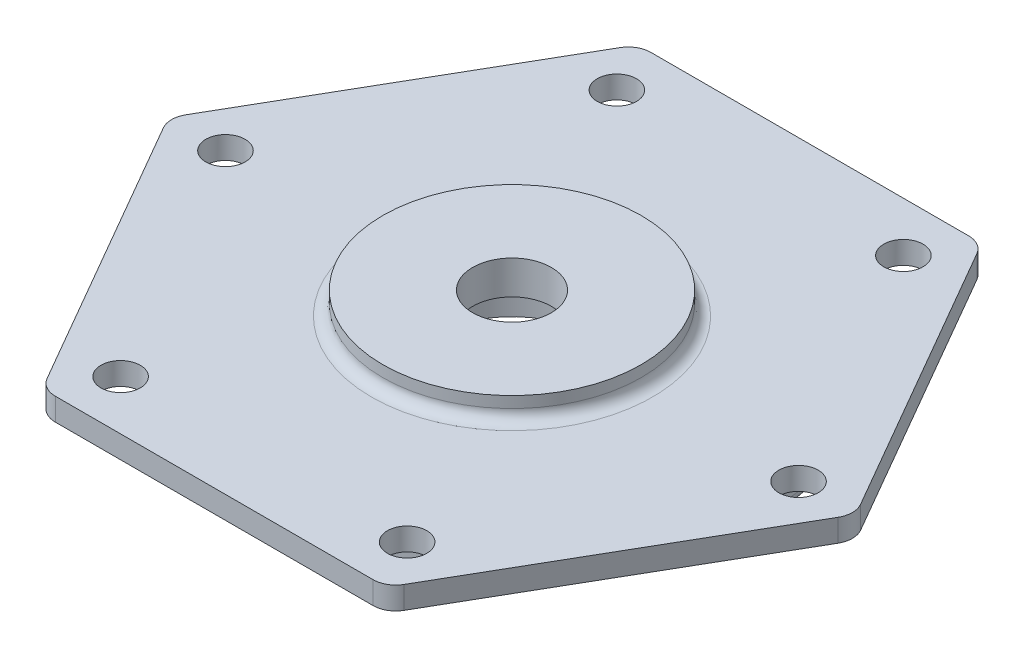
ISO-10303-21;
HEADER;
FILE_DESCRIPTION(('STEP AP214'),'2;1');
FILE_NAME('part.step','',(''),(''),'','','');
FILE_SCHEMA(('AUTOMOTIVE_DESIGN { 1 0 10303 214 1 1 1 1 }'));
ENDSEC;
DATA;
#1=APPLICATION_CONTEXT('core data for automotive mechanical design processes');
#2=APPLICATION_PROTOCOL_DEFINITION('international standard','automotive_design',2000,#1);
#3=PRODUCT_CONTEXT('',#1,'mechanical');
#4=PRODUCT('Part','Part','',(#3));
#5=PRODUCT_RELATED_PRODUCT_CATEGORY('part','',(#4));
#6=PRODUCT_DEFINITION_FORMATION('','',#4);
#7=PRODUCT_DEFINITION_CONTEXT('part definition',#1,'design');
#8=PRODUCT_DEFINITION('design','',#6,#7);
#9=PRODUCT_DEFINITION_SHAPE('','',#8);
#10=(LENGTH_UNIT() NAMED_UNIT(*) SI_UNIT(.MILLI.,.METRE.));
#11=(NAMED_UNIT(*) PLANE_ANGLE_UNIT() SI_UNIT($,.RADIAN.));
#12=(NAMED_UNIT(*) SI_UNIT($,.STERADIAN.) SOLID_ANGLE_UNIT());
#13=UNCERTAINTY_MEASURE_WITH_UNIT(LENGTH_MEASURE(1.E-05),#10,'distance_accuracy_value','');
#14=(GEOMETRIC_REPRESENTATION_CONTEXT(3) GLOBAL_UNCERTAINTY_ASSIGNED_CONTEXT((#13)) GLOBAL_UNIT_ASSIGNED_CONTEXT((#10,
#11,#12)) REPRESENTATION_CONTEXT('',''));
#15=CARTESIAN_POINT('',(0.,0.,0.));
#16=DIRECTION('',(0.,0.,1.));
#17=DIRECTION('',(1.,0.,0.));
#18=AXIS2_PLACEMENT_3D('',#15,#16,#17);
#19=CARTESIAN_POINT('',(-56.5803263805833,4.,0.));
#20=DIRECTION('',(0.,-1.,0.));
#21=DIRECTION('',(0.,0.,-1.));
#22=AXIS2_PLACEMENT_3D('',#19,#20,#21);
#23=CYLINDRICAL_SURFACE('',#22,4.);
#24=CARTESIAN_POINT('',(-56.5803263805833,0.,0.));
#25=DIRECTION('',(0.,1.,0.));
#26=DIRECTION('',(0.,0.,-1.));
#27=AXIS2_PLACEMENT_3D('',#24,#25,#26);
#28=CIRCLE('',#27,4.);
#29=CARTESIAN_POINT('',(-60.0444279957211,0.,-2.00000000000001));
#30=VERTEX_POINT('',#29);
#31=CARTESIAN_POINT('',(-60.0444279957211,0.,2.00000000000002));
#32=VERTEX_POINT('',#31);
#33=EDGE_CURVE('E171',#30,#32,#28,.T.);
#34=ORIENTED_EDGE('',*,*,#33,.T.);
#35=DIRECTION('',(0.,-1.,0.));
#36=VECTOR('',#35,1.);
#37=CARTESIAN_POINT('',(-60.0444279957211,4.,2.00000000000002));
#38=LINE('',#37,#36);
#39=CARTESIAN_POINT('',(-60.0444279957211,4.,2.00000000000002));
#40=VERTEX_POINT('',#39);
#41=EDGE_CURVE('E241',#40,#32,#38,.T.);
#42=ORIENTED_EDGE('',*,*,#41,.F.);
#43=CARTESIAN_POINT('',(-56.5803263805833,4.,0.));
#44=DIRECTION('',(0.,1.,0.));
#45=DIRECTION('',(0.,0.,-1.));
#46=AXIS2_PLACEMENT_3D('',#43,#44,#45);
#47=CIRCLE('',#46,4.);
#48=CARTESIAN_POINT('',(-60.0444279957211,4.,-2.00000000000001));
#49=VERTEX_POINT('',#48);
#50=EDGE_CURVE('E206',#49,#40,#47,.T.);
#51=ORIENTED_EDGE('',*,*,#50,.F.);
#52=DIRECTION('',(0.,-1.,0.));
#53=VECTOR('',#52,1.);
#54=CARTESIAN_POINT('',(-60.0444279957211,4.,-2.00000000000001));
#55=LINE('',#54,#53);
#56=EDGE_CURVE('E167',#49,#30,#55,.T.);
#57=ORIENTED_EDGE('',*,*,#56,.T.);
#58=EDGE_LOOP('',(#34,#42,#51,#57));
#59=FACE_BOUND('',#58,.T.);
#60=ADVANCED_FACE('F42',(#59),#23,.T.);
#61=CARTESIAN_POINT('',(-60.0444279957211,4.,2.00000000000002));
#62=DIRECTION('',(0.866025403784439,0.,-0.5));
#63=DIRECTION('',(-0.5,0.,-0.866025403784439));
#64=AXIS2_PLACEMENT_3D('',#61,#62,#63);
#65=PLANE('',#64);
#66=DIRECTION('',(0.5,0.,0.866025403784439));
#67=VECTOR('',#66,1.);
#68=CARTESIAN_POINT('',(-60.0444279957211,0.,2.00000000000002));
#69=LINE('',#68,#67);
#70=CARTESIAN_POINT('',(-31.7542648054294,0.,51.));
#71=VERTEX_POINT('',#70);
#72=EDGE_CURVE('E175',#32,#71,#69,.T.);
#73=ORIENTED_EDGE('',*,*,#72,.T.);
#74=DIRECTION('',(0.,-1.,0.));
#75=VECTOR('',#74,1.);
#76=CARTESIAN_POINT('',(-31.7542648054294,4.,51.));
#77=LINE('',#76,#75);
#78=CARTESIAN_POINT('',(-31.7542648054294,4.,51.));
#79=VERTEX_POINT('',#78);
#80=EDGE_CURVE('E237',#79,#71,#77,.T.);
#81=ORIENTED_EDGE('',*,*,#80,.F.);
#82=DIRECTION('',(0.5,0.,0.866025403784439));
#83=VECTOR('',#82,1.);
#84=CARTESIAN_POINT('',(-60.0444279957211,4.,2.00000000000002));
#85=LINE('',#84,#83);
#86=EDGE_CURVE('E118',#40,#79,#85,.T.);
#87=ORIENTED_EDGE('',*,*,#86,.F.);
#88=ORIENTED_EDGE('',*,*,#41,.T.);
#89=EDGE_LOOP('',(#73,#81,#87,#88));
#90=FACE_BOUND('',#89,.T.);
#91=ADVANCED_FACE('F378',(#90),#65,.F.);
#92=CARTESIAN_POINT('',(-28.2901631902917,4.,49.));
#93=DIRECTION('',(0.,-1.,0.));
#94=DIRECTION('',(0.,0.,-1.));
#95=AXIS2_PLACEMENT_3D('',#92,#93,#94);
#96=CYLINDRICAL_SURFACE('',#95,4.);
#97=CARTESIAN_POINT('',(-28.2901631902917,0.,49.));
#98=DIRECTION('',(0.,1.,0.));
#99=DIRECTION('',(0.,0.,1.));
#100=AXIS2_PLACEMENT_3D('',#97,#98,#99);
#101=CIRCLE('',#100,4.);
#102=CARTESIAN_POINT('',(-28.2901631902917,0.,53.));
#103=VERTEX_POINT('',#102);
#104=EDGE_CURVE('E179',#71,#103,#101,.T.);
#105=ORIENTED_EDGE('',*,*,#104,.T.);
#106=DIRECTION('',(0.,-1.,0.));
#107=VECTOR('',#106,1.);
#108=CARTESIAN_POINT('',(-28.2901631902917,4.,53.));
#109=LINE('',#108,#107);
#110=CARTESIAN_POINT('',(-28.2901631902917,4.,53.));
#111=VERTEX_POINT('',#110);
#112=EDGE_CURVE('E233',#111,#103,#109,.T.);
#113=ORIENTED_EDGE('',*,*,#112,.F.);
#114=CARTESIAN_POINT('',(-28.2901631902917,4.,49.));
#115=DIRECTION('',(0.,1.,0.));
#116=DIRECTION('',(0.,0.,1.));
#117=AXIS2_PLACEMENT_3D('',#114,#115,#116);
#118=CIRCLE('',#117,4.);
#119=EDGE_CURVE('E331',#79,#111,#118,.T.);
#120=ORIENTED_EDGE('',*,*,#119,.F.);
#121=ORIENTED_EDGE('',*,*,#80,.T.);
#122=EDGE_LOOP('',(#105,#113,#120,#121));
#123=FACE_BOUND('',#122,.T.);
#124=ADVANCED_FACE('F383',(#123),#96,.T.);
#125=CARTESIAN_POINT('',(-28.2901631902916,4.,53.));
#126=DIRECTION('',(0.,0.,-1.));
#127=DIRECTION('',(-1.,0.,0.));
#128=AXIS2_PLACEMENT_3D('',#125,#126,#127);
#129=PLANE('',#128);
#130=DIRECTION('',(1.,0.,0.));
#131=VECTOR('',#130,1.);
#132=CARTESIAN_POINT('',(-28.2901631902916,0.,53.));
#133=LINE('',#132,#131);
#134=CARTESIAN_POINT('',(28.2901631902916,0.,53.));
#135=VERTEX_POINT('',#134);
#136=EDGE_CURVE('E182',#103,#135,#133,.T.);
#137=ORIENTED_EDGE('',*,*,#136,.T.);
#138=DIRECTION('',(0.,-1.,0.));
#139=VECTOR('',#138,1.);
#140=CARTESIAN_POINT('',(28.2901631902916,4.,53.));
#141=LINE('',#140,#139);
#142=CARTESIAN_POINT('',(28.2901631902916,4.,53.));
#143=VERTEX_POINT('',#142);
#144=EDGE_CURVE('E229',#143,#135,#141,.T.);
#145=ORIENTED_EDGE('',*,*,#144,.F.);
#146=DIRECTION('',(1.,0.,0.));
#147=VECTOR('',#146,1.);
#148=CARTESIAN_POINT('',(-28.2901631902916,4.,53.));
#149=LINE('',#148,#147);
#150=EDGE_CURVE('E334',#111,#143,#149,.T.);
#151=ORIENTED_EDGE('',*,*,#150,.F.);
#152=ORIENTED_EDGE('',*,*,#112,.T.);
#153=EDGE_LOOP('',(#137,#145,#151,#152));
#154=FACE_BOUND('',#153,.T.);
#155=ADVANCED_FACE('F745',(#154),#129,.F.);
#156=CARTESIAN_POINT('',(28.2901631902917,4.,49.));
#157=DIRECTION('',(0.,-1.,0.));
#158=DIRECTION('',(0.,0.,-1.));
#159=AXIS2_PLACEMENT_3D('',#156,#157,#158);
#160=CYLINDRICAL_SURFACE('',#159,4.);
#161=CARTESIAN_POINT('',(28.2901631902917,0.,49.));
#162=DIRECTION('',(0.,1.,0.));
#163=DIRECTION('',(0.,0.,1.));
#164=AXIS2_PLACEMENT_3D('',#161,#162,#163);
#165=CIRCLE('',#164,4.);
#166=CARTESIAN_POINT('',(31.7542648054294,0.,51.));
#167=VERTEX_POINT('',#166);
#168=EDGE_CURVE('E185',#135,#167,#165,.T.);
#169=ORIENTED_EDGE('',*,*,#168,.T.);
#170=DIRECTION('',(0.,-1.,0.));
#171=VECTOR('',#170,1.);
#172=CARTESIAN_POINT('',(31.7542648054294,4.,51.));
#173=LINE('',#172,#171);
#174=CARTESIAN_POINT('',(31.7542648054294,4.,51.));
#175=VERTEX_POINT('',#174);
#176=EDGE_CURVE('E225',#175,#167,#173,.T.);
#177=ORIENTED_EDGE('',*,*,#176,.F.);
#178=CARTESIAN_POINT('',(28.2901631902917,4.,49.));
#179=DIRECTION('',(0.,1.,0.));
#180=DIRECTION('',(0.,0.,1.));
#181=AXIS2_PLACEMENT_3D('',#178,#179,#180);
#182=CIRCLE('',#181,4.);
#183=EDGE_CURVE('E337',#143,#175,#182,.T.);
#184=ORIENTED_EDGE('',*,*,#183,.F.);
#185=ORIENTED_EDGE('',*,*,#144,.T.);
#186=EDGE_LOOP('',(#169,#177,#184,#185));
#187=FACE_BOUND('',#186,.T.);
#188=ADVANCED_FACE('F735',(#187),#160,.T.);
#189=CARTESIAN_POINT('',(31.7542648054294,4.,51.));
#190=DIRECTION('',(-0.866025403784439,0.,-0.499999999999999));
#191=DIRECTION('',(-0.499999999999999,0.,0.866025403784439));
#192=AXIS2_PLACEMENT_3D('',#189,#190,#191);
#193=PLANE('',#192);
#194=DIRECTION('',(0.499999999999999,0.,-0.866025403784439));
#195=VECTOR('',#194,1.);
#196=CARTESIAN_POINT('',(31.7542648054294,0.,51.));
#197=LINE('',#196,#195);
#198=CARTESIAN_POINT('',(60.044427995721,0.,2.));
#199=VERTEX_POINT('',#198);
#200=EDGE_CURVE('E188',#167,#199,#197,.T.);
#201=ORIENTED_EDGE('',*,*,#200,.T.);
#202=DIRECTION('',(0.,-1.,0.));
#203=VECTOR('',#202,1.);
#204=CARTESIAN_POINT('',(60.044427995721,4.,2.));
#205=LINE('',#204,#203);
#206=CARTESIAN_POINT('',(60.044427995721,4.,2.));
#207=VERTEX_POINT('',#206);
#208=EDGE_CURVE('E221',#207,#199,#205,.T.);
#209=ORIENTED_EDGE('',*,*,#208,.F.);
#210=DIRECTION('',(0.499999999999999,0.,-0.866025403784439));
#211=VECTOR('',#210,1.);
#212=CARTESIAN_POINT('',(31.7542648054294,4.,51.));
#213=LINE('',#212,#211);
#214=EDGE_CURVE('E340',#175,#207,#213,.T.);
#215=ORIENTED_EDGE('',*,*,#214,.F.);
#216=ORIENTED_EDGE('',*,*,#176,.T.);
#217=EDGE_LOOP('',(#201,#209,#215,#216));
#218=FACE_BOUND('',#217,.T.);
#219=ADVANCED_FACE('F725',(#218),#193,.F.);
#220=CARTESIAN_POINT('',(56.5803263805833,4.,0.));
#221=DIRECTION('',(0.,-1.,0.));
#222=DIRECTION('',(0.,0.,-1.));
#223=AXIS2_PLACEMENT_3D('',#220,#221,#222);
#224=CYLINDRICAL_SURFACE('',#223,4.);
#225=CARTESIAN_POINT('',(56.5803263805833,0.,0.));
#226=DIRECTION('',(0.,1.,0.));
#227=DIRECTION('',(0.,0.,1.));
#228=AXIS2_PLACEMENT_3D('',#225,#226,#227);
#229=CIRCLE('',#228,4.);
#230=CARTESIAN_POINT('',(60.044427995721,0.,-2.00000000000003));
#231=VERTEX_POINT('',#230);
#232=EDGE_CURVE('E191',#199,#231,#229,.T.);
#233=ORIENTED_EDGE('',*,*,#232,.T.);
#234=DIRECTION('',(0.,-1.,0.));
#235=VECTOR('',#234,1.);
#236=CARTESIAN_POINT('',(60.044427995721,4.,-2.00000000000003));
#237=LINE('',#236,#235);
#238=CARTESIAN_POINT('',(60.044427995721,4.,-2.00000000000003));
#239=VERTEX_POINT('',#238);
#240=EDGE_CURVE('E217',#239,#231,#237,.T.);
#241=ORIENTED_EDGE('',*,*,#240,.F.);
#242=CARTESIAN_POINT('',(56.5803263805833,4.,0.));
#243=DIRECTION('',(0.,1.,0.));
#244=DIRECTION('',(0.,0.,1.));
#245=AXIS2_PLACEMENT_3D('',#242,#243,#244);
#246=CIRCLE('',#245,4.);
#247=EDGE_CURVE('E343',#207,#239,#246,.T.);
#248=ORIENTED_EDGE('',*,*,#247,.F.);
#249=ORIENTED_EDGE('',*,*,#208,.T.);
#250=EDGE_LOOP('',(#233,#241,#248,#249));
#251=FACE_BOUND('',#250,.T.);
#252=ADVANCED_FACE('F716',(#251),#224,.T.);
#253=CARTESIAN_POINT('',(60.044427995721,4.,-2.00000000000003));
#254=DIRECTION('',(-0.866025403784439,0.,0.5));
#255=DIRECTION('',(0.5,0.,0.866025403784439));
#256=AXIS2_PLACEMENT_3D('',#253,#254,#255);
#257=PLANE('',#256);
#258=DIRECTION('',(-0.5,0.,-0.866025403784439));
#259=VECTOR('',#258,1.);
#260=CARTESIAN_POINT('',(60.044427995721,0.,-2.00000000000003));
#261=LINE('',#260,#259);
#262=CARTESIAN_POINT('',(31.7542648054294,0.,-51.));
#263=VERTEX_POINT('',#262);
#264=EDGE_CURVE('E194',#231,#263,#261,.T.);
#265=ORIENTED_EDGE('',*,*,#264,.T.);
#266=DIRECTION('',(0.,-1.,0.));
#267=VECTOR('',#266,1.);
#268=CARTESIAN_POINT('',(31.7542648054294,4.,-51.));
#269=LINE('',#268,#267);
#270=CARTESIAN_POINT('',(31.7542648054294,4.,-51.));
#271=VERTEX_POINT('',#270);
#272=EDGE_CURVE('E213',#271,#263,#269,.T.);
#273=ORIENTED_EDGE('',*,*,#272,.F.);
#274=DIRECTION('',(-0.5,0.,-0.866025403784439));
#275=VECTOR('',#274,1.);
#276=CARTESIAN_POINT('',(60.044427995721,4.,-2.00000000000003));
#277=LINE('',#276,#275);
#278=EDGE_CURVE('E346',#239,#271,#277,.T.);
#279=ORIENTED_EDGE('',*,*,#278,.F.);
#280=ORIENTED_EDGE('',*,*,#240,.T.);
#281=EDGE_LOOP('',(#265,#273,#279,#280));
#282=FACE_BOUND('',#281,.T.);
#283=ADVANCED_FACE('F354',(#282),#257,.F.);
#284=CARTESIAN_POINT('',(28.2901631902916,4.,-49.));
#285=DIRECTION('',(0.,-1.,0.));
#286=DIRECTION('',(0.,0.,-1.));
#287=AXIS2_PLACEMENT_3D('',#284,#285,#286);
#288=CYLINDRICAL_SURFACE('',#287,4.);
#289=CARTESIAN_POINT('',(28.2901631902916,0.,-49.));
#290=DIRECTION('',(0.,1.,0.));
#291=DIRECTION('',(0.,0.,-1.));
#292=AXIS2_PLACEMENT_3D('',#289,#290,#291);
#293=CIRCLE('',#292,4.);
#294=CARTESIAN_POINT('',(28.2901631902916,0.,-53.));
#295=VERTEX_POINT('',#294);
#296=EDGE_CURVE('E197',#263,#295,#293,.T.);
#297=ORIENTED_EDGE('',*,*,#296,.T.);
#298=DIRECTION('',(0.,-1.,0.));
#299=VECTOR('',#298,1.);
#300=CARTESIAN_POINT('',(28.2901631902916,4.,-53.));
#301=LINE('',#300,#299);
#302=CARTESIAN_POINT('',(28.2901631902916,4.,-53.));
#303=VERTEX_POINT('',#302);
#304=EDGE_CURVE('E160',#303,#295,#301,.T.);
#305=ORIENTED_EDGE('',*,*,#304,.F.);
#306=CARTESIAN_POINT('',(28.2901631902916,4.,-49.));
#307=DIRECTION('',(0.,1.,0.));
#308=DIRECTION('',(0.,0.,-1.));
#309=AXIS2_PLACEMENT_3D('',#306,#307,#308);
#310=CIRCLE('',#309,4.);
#311=EDGE_CURVE('E149',#271,#303,#310,.T.);
#312=ORIENTED_EDGE('',*,*,#311,.F.);
#313=ORIENTED_EDGE('',*,*,#272,.T.);
#314=EDGE_LOOP('',(#297,#305,#312,#313));
#315=FACE_BOUND('',#314,.T.);
#316=ADVANCED_FACE('F358',(#315),#288,.T.);
#317=CARTESIAN_POINT('',(28.2901631902916,4.,-53.));
#318=DIRECTION('',(0.,0.,1.));
#319=DIRECTION('',(1.,0.,0.));
#320=AXIS2_PLACEMENT_3D('',#317,#318,#319);
#321=PLANE('',#320);
#322=DIRECTION('',(-1.,0.,0.));
#323=VECTOR('',#322,1.);
#324=CARTESIAN_POINT('',(28.2901631902916,0.,-53.));
#325=LINE('',#324,#323);
#326=CARTESIAN_POINT('',(-28.2901631902917,0.,-53.));
#327=VERTEX_POINT('',#326);
#328=EDGE_CURVE('E158',#295,#327,#325,.T.);
#329=ORIENTED_EDGE('',*,*,#328,.T.);
#330=DIRECTION('',(0.,-1.,0.));
#331=VECTOR('',#330,1.);
#332=CARTESIAN_POINT('',(-28.2901631902917,4.,-53.));
#333=LINE('',#332,#331);
#334=CARTESIAN_POINT('',(-28.2901631902917,4.,-53.));
#335=VERTEX_POINT('',#334);
#336=EDGE_CURVE('E155',#335,#327,#333,.T.);
#337=ORIENTED_EDGE('',*,*,#336,.F.);
#338=DIRECTION('',(-1.,0.,0.));
#339=VECTOR('',#338,1.);
#340=CARTESIAN_POINT('',(28.2901631902916,4.,-53.));
#341=LINE('',#340,#339);
#342=EDGE_CURVE('E143',#303,#335,#341,.T.);
#343=ORIENTED_EDGE('',*,*,#342,.F.);
#344=ORIENTED_EDGE('',*,*,#304,.T.);
#345=EDGE_LOOP('',(#329,#337,#343,#344));
#346=FACE_BOUND('',#345,.T.);
#347=ADVANCED_FACE('F156',(#346),#321,.F.);
#348=CARTESIAN_POINT('',(-28.2901631902917,4.,-49.));
#349=DIRECTION('',(0.,-1.,0.));
#350=DIRECTION('',(0.,0.,-1.));
#351=AXIS2_PLACEMENT_3D('',#348,#349,#350);
#352=CYLINDRICAL_SURFACE('',#351,4.);
#353=CARTESIAN_POINT('',(-28.2901631902917,0.,-49.));
#354=DIRECTION('',(0.,1.,0.));
#355=DIRECTION('',(0.,0.,1.));
#356=AXIS2_PLACEMENT_3D('',#353,#354,#355);
#357=CIRCLE('',#356,4.);
#358=CARTESIAN_POINT('',(-31.7542648054294,0.,-51.));
#359=VERTEX_POINT('',#358);
#360=EDGE_CURVE('E103',#327,#359,#357,.T.);
#361=ORIENTED_EDGE('',*,*,#360,.T.);
#362=DIRECTION('',(0.,-1.,0.));
#363=VECTOR('',#362,1.);
#364=CARTESIAN_POINT('',(-31.7542648054294,4.,-51.));
#365=LINE('',#364,#363);
#366=CARTESIAN_POINT('',(-31.7542648054294,4.,-51.));
#367=VERTEX_POINT('',#366);
#368=EDGE_CURVE('E161',#367,#359,#365,.T.);
#369=ORIENTED_EDGE('',*,*,#368,.F.);
#370=CARTESIAN_POINT('',(-28.2901631902917,4.,-49.));
#371=DIRECTION('',(0.,1.,0.));
#372=DIRECTION('',(0.,0.,1.));
#373=AXIS2_PLACEMENT_3D('',#370,#371,#372);
#374=CIRCLE('',#373,4.);
#375=EDGE_CURVE('E147',#335,#367,#374,.T.);
#376=ORIENTED_EDGE('',*,*,#375,.F.);
#377=ORIENTED_EDGE('',*,*,#336,.T.);
#378=EDGE_LOOP('',(#361,#369,#376,#377));
#379=FACE_BOUND('',#378,.T.);
#380=ADVANCED_FACE('F163',(#379),#352,.T.);
#381=CARTESIAN_POINT('',(-31.7542648054294,4.,-51.));
#382=DIRECTION('',(0.866025403784439,0.,0.5));
#383=DIRECTION('',(0.5,0.,-0.866025403784439));
#384=AXIS2_PLACEMENT_3D('',#381,#382,#383);
#385=PLANE('',#384);
#386=DIRECTION('',(-0.5,0.,0.866025403784439));
#387=VECTOR('',#386,1.);
#388=CARTESIAN_POINT('',(-31.7542648054294,0.,-51.));
#389=LINE('',#388,#387);
#390=EDGE_CURVE('E109',#359,#30,#389,.T.);
#391=ORIENTED_EDGE('',*,*,#390,.T.);
#392=ORIENTED_EDGE('',*,*,#56,.F.);
#393=DIRECTION('',(-0.5,0.,0.866025403784439));
#394=VECTOR('',#393,1.);
#395=CARTESIAN_POINT('',(-31.7542648054294,4.,-51.));
#396=LINE('',#395,#394);
#397=EDGE_CURVE('E62',#367,#49,#396,.T.);
#398=ORIENTED_EDGE('',*,*,#397,.F.);
#399=ORIENTED_EDGE('',*,*,#368,.T.);
#400=EDGE_LOOP('',(#391,#392,#398,#399));
#401=FACE_BOUND('',#400,.T.);
#402=ADVANCED_FACE('F366',(#401),#385,.F.);
#403=CARTESIAN_POINT('',(-56.5803263805833,4.,0.));
#404=DIRECTION('',(0.,-1.,0.));
#405=DIRECTION('',(0.,0.,-1.));
#406=AXIS2_PLACEMENT_3D('',#403,#404,#405);
#407=PLANE('',#406);
#408=CARTESIAN_POINT('',(51.,4.,0.));
#409=DIRECTION('',(0.,1.,0.));
#410=DIRECTION('',(0.,0.,1.));
#411=AXIS2_PLACEMENT_3D('',#408,#409,#410);
#412=CIRCLE('',#411,3.5);
#413=CARTESIAN_POINT('',(51.,4.,3.5));
#414=VERTEX_POINT('',#413);
#415=EDGE_CURVE('E269',#414,#414,#412,.T.);
#416=ORIENTED_EDGE('',*,*,#415,.F.);
#417=EDGE_LOOP('',(#416));
#418=FACE_BOUND('',#417,.T.);
#419=CARTESIAN_POINT('',(25.5000000000005,4.,-44.1672955930061));
#420=DIRECTION('',(0.,1.,0.));
#421=DIRECTION('',(0.,0.,1.));
#422=AXIS2_PLACEMENT_3D('',#419,#420,#421);
#423=CIRCLE('',#422,3.5);
#424=CARTESIAN_POINT('',(25.5000000000005,4.,-40.6672955930061));
#425=VERTEX_POINT('',#424);
#426=EDGE_CURVE('E484',#425,#425,#423,.T.);
#427=ORIENTED_EDGE('',*,*,#426,.F.);
#428=EDGE_LOOP('',(#427));
#429=FACE_BOUND('',#428,.T.);
#430=CARTESIAN_POINT('',(-25.4999999999996,4.,-44.1672955930066));
#431=DIRECTION('',(0.,1.,0.));
#432=DIRECTION('',(0.,0.,1.));
#433=AXIS2_PLACEMENT_3D('',#430,#431,#432);
#434=CIRCLE('',#433,3.5);
#435=CARTESIAN_POINT('',(-25.4999999999996,4.,-40.6672955930066));
#436=VERTEX_POINT('',#435);
#437=EDGE_CURVE('E488',#436,#436,#434,.T.);
#438=ORIENTED_EDGE('',*,*,#437,.F.);
#439=EDGE_LOOP('',(#438));
#440=FACE_BOUND('',#439,.T.);
#441=CARTESIAN_POINT('',(-51.,4.,-3.56131096562E-13));
#442=DIRECTION('',(0.,1.,0.));
#443=DIRECTION('',(0.,0.,1.));
#444=AXIS2_PLACEMENT_3D('',#441,#442,#443);
#445=CIRCLE('',#444,3.5);
#446=CARTESIAN_POINT('',(-51.,4.,3.49999999999964));
#447=VERTEX_POINT('',#446);
#448=EDGE_CURVE('E481',#447,#447,#445,.T.);
#449=ORIENTED_EDGE('',*,*,#448,.F.);
#450=EDGE_LOOP('',(#449));
#451=FACE_BOUND('',#450,.T.);
#452=CARTESIAN_POINT('',(-25.5000000000002,4.,44.1672955930063));
#453=DIRECTION('',(0.,1.,0.));
#454=DIRECTION('',(0.,0.,1.));
#455=AXIS2_PLACEMENT_3D('',#452,#453,#454);
#456=CIRCLE('',#455,3.5);
#457=CARTESIAN_POINT('',(-25.5000000000002,4.,47.6672955930063));
#458=VERTEX_POINT('',#457);
#459=EDGE_CURVE('E474',#458,#458,#456,.T.);
#460=ORIENTED_EDGE('',*,*,#459,.F.);
#461=EDGE_LOOP('',(#460));
#462=FACE_BOUND('',#461,.T.);
#463=CARTESIAN_POINT('',(25.4999999999999,4.,44.1672955930064));
#464=DIRECTION('',(0.,1.,0.));
#465=DIRECTION('',(0.,0.,1.));
#466=AXIS2_PLACEMENT_3D('',#463,#464,#465);
#467=CIRCLE('',#466,3.5);
#468=CARTESIAN_POINT('',(25.4999999999999,4.,47.6672955930064));
#469=VERTEX_POINT('',#468);
#470=EDGE_CURVE('E471',#469,#469,#467,.T.);
#471=ORIENTED_EDGE('',*,*,#470,.F.);
#472=EDGE_LOOP('',(#471));
#473=FACE_BOUND('',#472,.T.);
#474=CARTESIAN_POINT('',(0.,4.,0.));
#475=DIRECTION('',(0.,-1.,0.));
#476=DIRECTION('',(0.,0.,-1.));
#477=AXIS2_PLACEMENT_3D('',#474,#475,#476);
#478=CIRCLE('',#477,25.);
#479=CARTESIAN_POINT('',(0.,4.,-25.));
#480=VERTEX_POINT('',#479);
#481=EDGE_CURVE('E249',#480,#480,#478,.T.);
#482=ORIENTED_EDGE('',*,*,#481,.T.);
#483=EDGE_LOOP('',(#482));
#484=FACE_BOUND('',#483,.T.);
#485=ORIENTED_EDGE('',*,*,#50,.T.);
#486=ORIENTED_EDGE('',*,*,#86,.T.);
#487=ORIENTED_EDGE('',*,*,#119,.T.);
#488=ORIENTED_EDGE('',*,*,#150,.T.);
#489=ORIENTED_EDGE('',*,*,#183,.T.);
#490=ORIENTED_EDGE('',*,*,#214,.T.);
#491=ORIENTED_EDGE('',*,*,#247,.T.);
#492=ORIENTED_EDGE('',*,*,#278,.T.);
#493=ORIENTED_EDGE('',*,*,#311,.T.);
#494=ORIENTED_EDGE('',*,*,#342,.T.);
#495=ORIENTED_EDGE('',*,*,#375,.T.);
#496=ORIENTED_EDGE('',*,*,#397,.T.);
#497=EDGE_LOOP('',(#485,#486,#487,#488,#489,#490,#491,#492,#493,#494,#495,#496));
#498=FACE_BOUND('',#497,.T.);
#499=ADVANCED_FACE('F145',(#418,#429,#440,#451,#462,#473,#484,#498),#407,.F.);
#500=CARTESIAN_POINT('',(-56.5803263805833,0.,0.));
#501=DIRECTION('',(0.,-1.,0.));
#502=DIRECTION('',(0.,0.,-1.));
#503=AXIS2_PLACEMENT_3D('',#500,#501,#502);
#504=PLANE('',#503);
#505=CARTESIAN_POINT('',(51.,0.,0.));
#506=DIRECTION('',(0.,-1.,0.));
#507=DIRECTION('',(0.,0.,-1.));
#508=AXIS2_PLACEMENT_3D('',#505,#506,#507);
#509=CIRCLE('',#508,3.5);
#510=CARTESIAN_POINT('',(51.,0.,-3.5));
#511=VERTEX_POINT('',#510);
#512=EDGE_CURVE('E46',#511,#511,#509,.T.);
#513=ORIENTED_EDGE('',*,*,#512,.F.);
#514=EDGE_LOOP('',(#513));
#515=FACE_BOUND('',#514,.T.);
#516=CARTESIAN_POINT('',(25.5000000000005,0.,-44.1672955930061));
#517=DIRECTION('',(0.,-1.,0.));
#518=DIRECTION('',(0.,0.,-1.));
#519=AXIS2_PLACEMENT_3D('',#516,#517,#518);
#520=CIRCLE('',#519,3.5);
#521=CARTESIAN_POINT('',(25.5000000000005,0.,-47.6672955930061));
#522=VERTEX_POINT('',#521);
#523=EDGE_CURVE('E280',#522,#522,#520,.T.);
#524=ORIENTED_EDGE('',*,*,#523,.F.);
#525=EDGE_LOOP('',(#524));
#526=FACE_BOUND('',#525,.T.);
#527=CARTESIAN_POINT('',(-25.4999999999996,0.,-44.1672955930066));
#528=DIRECTION('',(0.,-1.,0.));
#529=DIRECTION('',(0.,0.,-1.));
#530=AXIS2_PLACEMENT_3D('',#527,#528,#529);
#531=CIRCLE('',#530,3.5);
#532=CARTESIAN_POINT('',(-25.4999999999996,0.,-47.6672955930066));
#533=VERTEX_POINT('',#532);
#534=EDGE_CURVE('E277',#533,#533,#531,.T.);
#535=ORIENTED_EDGE('',*,*,#534,.F.);
#536=EDGE_LOOP('',(#535));
#537=FACE_BOUND('',#536,.T.);
#538=CARTESIAN_POINT('',(-51.,0.,-3.56131096562E-13));
#539=DIRECTION('',(0.,-1.,0.));
#540=DIRECTION('',(0.,0.,-1.));
#541=AXIS2_PLACEMENT_3D('',#538,#539,#540);
#542=CIRCLE('',#541,3.5);
#543=CARTESIAN_POINT('',(-51.,0.,-3.50000000000036));
#544=VERTEX_POINT('',#543);
#545=EDGE_CURVE('E273',#544,#544,#542,.T.);
#546=ORIENTED_EDGE('',*,*,#545,.F.);
#547=EDGE_LOOP('',(#546));
#548=FACE_BOUND('',#547,.T.);
#549=CARTESIAN_POINT('',(-25.5000000000002,0.,44.1672955930063));
#550=DIRECTION('',(0.,-1.,0.));
#551=DIRECTION('',(0.,0.,-1.));
#552=AXIS2_PLACEMENT_3D('',#549,#550,#551);
#553=CIRCLE('',#552,3.5);
#554=CARTESIAN_POINT('',(-25.5000000000002,0.,40.6672955930063));
#555=VERTEX_POINT('',#554);
#556=EDGE_CURVE('E268',#555,#555,#553,.T.);
#557=ORIENTED_EDGE('',*,*,#556,.F.);
#558=EDGE_LOOP('',(#557));
#559=FACE_BOUND('',#558,.T.);
#560=CARTESIAN_POINT('',(25.4999999999999,0.,44.1672955930064));
#561=DIRECTION('',(0.,-1.,0.));
#562=DIRECTION('',(0.,0.,-1.));
#563=AXIS2_PLACEMENT_3D('',#560,#561,#562);
#564=CIRCLE('',#563,3.5);
#565=CARTESIAN_POINT('',(25.4999999999999,0.,40.6672955930064));
#566=VERTEX_POINT('',#565);
#567=EDGE_CURVE('E264',#566,#566,#564,.T.);
#568=ORIENTED_EDGE('',*,*,#567,.F.);
#569=EDGE_LOOP('',(#568));
#570=FACE_BOUND('',#569,.T.);
#571=CARTESIAN_POINT('',(0.,0.,0.));
#572=DIRECTION('',(0.,-1.,0.));
#573=DIRECTION('',(0.,0.,-1.));
#574=AXIS2_PLACEMENT_3D('',#571,#572,#573);
#575=CIRCLE('',#574,45.);
#576=CARTESIAN_POINT('',(0.,0.,-45.));
#577=VERTEX_POINT('',#576);
#578=EDGE_CURVE('E244',#577,#577,#575,.T.);
#579=ORIENTED_EDGE('',*,*,#578,.F.);
#580=EDGE_LOOP('',(#579));
#581=FACE_BOUND('',#580,.T.);
#582=ORIENTED_EDGE('',*,*,#33,.F.);
#583=ORIENTED_EDGE('',*,*,#390,.F.);
#584=ORIENTED_EDGE('',*,*,#360,.F.);
#585=ORIENTED_EDGE('',*,*,#328,.F.);
#586=ORIENTED_EDGE('',*,*,#296,.F.);
#587=ORIENTED_EDGE('',*,*,#264,.F.);
#588=ORIENTED_EDGE('',*,*,#232,.F.);
#589=ORIENTED_EDGE('',*,*,#200,.F.);
#590=ORIENTED_EDGE('',*,*,#168,.F.);
#591=ORIENTED_EDGE('',*,*,#136,.F.);
#592=ORIENTED_EDGE('',*,*,#104,.F.);
#593=ORIENTED_EDGE('',*,*,#72,.F.);
#594=EDGE_LOOP('',(#582,#583,#584,#585,#586,#587,#588,#589,#590,#591,#592,#593));
#595=FACE_BOUND('',#594,.T.);
#596=ADVANCED_FACE('F361',(#515,#526,#537,#548,#559,#570,#581,#595),#504,.T.);
#597=CARTESIAN_POINT('',(0.,8.,0.));
#598=DIRECTION('',(0.,-1.,0.));
#599=DIRECTION('',(0.,0.,-1.));
#600=AXIS2_PLACEMENT_3D('',#597,#598,#599);
#601=CYLINDRICAL_SURFACE('',#600,23.);
#602=CARTESIAN_POINT('',(0.,6.,0.));
#603=DIRECTION('',(0.,-1.,0.));
#604=DIRECTION('',(0.,0.,-1.));
#605=AXIS2_PLACEMENT_3D('',#602,#603,#604);
#606=CIRCLE('',#605,23.);
#607=CARTESIAN_POINT('',(0.,6.,-23.));
#608=VERTEX_POINT('',#607);
#609=EDGE_CURVE('E245',#608,#608,#606,.F.);
#610=ORIENTED_EDGE('',*,*,#609,.T.);
#611=EDGE_LOOP('',(#610));
#612=FACE_BOUND('',#611,.T.);
#613=CARTESIAN_POINT('',(0.,8.,0.));
#614=DIRECTION('',(0.,1.,0.));
#615=DIRECTION('',(0.,0.,1.));
#616=AXIS2_PLACEMENT_3D('',#613,#614,#615);
#617=CIRCLE('',#616,23.);
#618=CARTESIAN_POINT('',(0.,8.,23.));
#619=VERTEX_POINT('',#618);
#620=EDGE_CURVE('E176',#619,#619,#617,.T.);
#621=ORIENTED_EDGE('',*,*,#620,.F.);
#622=EDGE_LOOP('',(#621));
#623=FACE_BOUND('',#622,.T.);
#624=ADVANCED_FACE('F444',(#612,#623),#601,.T.);
#625=CARTESIAN_POINT('',(0.,8.,0.));
#626=DIRECTION('',(0.,1.,0.));
#627=DIRECTION('',(0.,0.,1.));
#628=AXIS2_PLACEMENT_3D('',#625,#626,#627);
#629=PLANE('',#628);
#630=CARTESIAN_POINT('',(0.,8.,0.));
#631=DIRECTION('',(0.,-1.,0.));
#632=DIRECTION('',(0.,0.,-1.));
#633=AXIS2_PLACEMENT_3D('',#630,#631,#632);
#634=CIRCLE('',#633,7.);
#635=CARTESIAN_POINT('',(0.,8.,-7.));
#636=VERTEX_POINT('',#635);
#637=EDGE_CURVE('E292',#636,#636,#634,.T.);
#638=ORIENTED_EDGE('',*,*,#637,.T.);
#639=EDGE_LOOP('',(#638));
#640=FACE_BOUND('',#639,.T.);
#641=ORIENTED_EDGE('',*,*,#620,.T.);
#642=EDGE_LOOP('',(#641));
#643=FACE_BOUND('',#642,.T.);
#644=ADVANCED_FACE('F440',(#640,#643),#629,.T.);
#645=CARTESIAN_POINT('',(0.,-6.,0.));
#646=DIRECTION('',(0.,1.,0.));
#647=DIRECTION('',(0.,0.,1.));
#648=AXIS2_PLACEMENT_3D('',#645,#646,#647);
#649=CYLINDRICAL_SURFACE('',#648,45.);
#650=CARTESIAN_POINT('',(0.,-4.,0.));
#651=DIRECTION('',(0.,-1.,0.));
#652=DIRECTION('',(0.,0.,-1.));
#653=AXIS2_PLACEMENT_3D('',#650,#651,#652);
#654=CIRCLE('',#653,45.);
#655=CARTESIAN_POINT('',(0.,-4.,-45.));
#656=VERTEX_POINT('',#655);
#657=EDGE_CURVE('E11',#656,#656,#654,.F.);
#658=ORIENTED_EDGE('',*,*,#657,.T.);
#659=EDGE_LOOP('',(#658));
#660=FACE_BOUND('',#659,.T.);
#661=ORIENTED_EDGE('',*,*,#578,.T.);
#662=EDGE_LOOP('',(#661));
#663=FACE_BOUND('',#662,.T.);
#664=ADVANCED_FACE('F436',(#660,#663),#649,.T.);
#665=CARTESIAN_POINT('',(0.,-6.,0.));
#666=DIRECTION('',(0.,-1.,0.));
#667=DIRECTION('',(0.,0.,-1.));
#668=AXIS2_PLACEMENT_3D('',#665,#666,#667);
#669=PLANE('',#668);
#670=CARTESIAN_POINT('',(0.,-6.,0.));
#671=DIRECTION('',(0.,-1.,0.));
#672=DIRECTION('',(0.,0.,-1.));
#673=AXIS2_PLACEMENT_3D('',#670,#671,#672);
#674=CIRCLE('',#673,43.);
#675=CARTESIAN_POINT('',(0.,-6.,-43.));
#676=VERTEX_POINT('',#675);
#677=EDGE_CURVE('E53',#676,#676,#674,.T.);
#678=ORIENTED_EDGE('',*,*,#677,.T.);
#679=EDGE_LOOP('',(#678));
#680=FACE_BOUND('',#679,.T.);
#681=CARTESIAN_POINT('',(0.,-6.,0.));
#682=DIRECTION('',(0.,-1.,0.));
#683=DIRECTION('',(0.,0.,-1.));
#684=AXIS2_PLACEMENT_3D('',#681,#682,#683);
#685=CIRCLE('',#684,40.);
#686=CARTESIAN_POINT('',(0.,-6.,-40.));
#687=VERTEX_POINT('',#686);
#688=EDGE_CURVE('E313',#687,#687,#685,.T.);
#689=ORIENTED_EDGE('',*,*,#688,.F.);
#690=EDGE_LOOP('',(#689));
#691=FACE_BOUND('',#690,.T.);
#692=ADVANCED_FACE('F409',(#680,#691),#669,.T.);
#693=CARTESIAN_POINT('',(0.,0.,0.));
#694=DIRECTION('',(0.,-1.,0.));
#695=DIRECTION('',(0.,0.,-1.));
#696=AXIS2_PLACEMENT_3D('',#693,#694,#695);
#697=CYLINDRICAL_SURFACE('',#696,40.);
#698=CARTESIAN_POINT('',(0.,0.,0.));
#699=DIRECTION('',(0.,-1.,0.));
#700=DIRECTION('',(0.,0.,-1.));
#701=AXIS2_PLACEMENT_3D('',#698,#699,#700);
#702=CIRCLE('',#701,40.);
#703=CARTESIAN_POINT('',(0.,0.,-40.));
#704=VERTEX_POINT('',#703);
#705=EDGE_CURVE('E314',#704,#704,#702,.T.);
#706=ORIENTED_EDGE('',*,*,#705,.F.);
#707=EDGE_LOOP('',(#706));
#708=FACE_BOUND('',#707,.T.);
#709=ORIENTED_EDGE('',*,*,#688,.T.);
#710=EDGE_LOOP('',(#709));
#711=FACE_BOUND('',#710,.T.);
#712=ADVANCED_FACE('F430',(#708,#711),#697,.F.);
#713=CARTESIAN_POINT('',(0.,0.,0.));
#714=DIRECTION('',(0.,-1.,0.));
#715=DIRECTION('',(0.,0.,-1.));
#716=AXIS2_PLACEMENT_3D('',#713,#714,#715);
#717=PLANE('',#716);
#718=CARTESIAN_POINT('',(0.,0.,0.));
#719=DIRECTION('',(0.,-1.,0.));
#720=DIRECTION('',(0.,0.,-1.));
#721=AXIS2_PLACEMENT_3D('',#718,#719,#720);
#722=CIRCLE('',#721,19.);
#723=CARTESIAN_POINT('',(0.,0.,-19.));
#724=VERTEX_POINT('',#723);
#725=EDGE_CURVE('E306',#724,#724,#722,.T.);
#726=ORIENTED_EDGE('',*,*,#725,.F.);
#727=EDGE_LOOP('',(#726));
#728=FACE_BOUND('',#727,.T.);
#729=ORIENTED_EDGE('',*,*,#705,.T.);
#730=EDGE_LOOP('',(#729));
#731=FACE_BOUND('',#730,.T.);
#732=ADVANCED_FACE('F426',(#728,#731),#717,.T.);
#733=CARTESIAN_POINT('',(0.,0.,0.));
#734=DIRECTION('',(0.,-1.,0.));
#735=DIRECTION('',(0.,0.,-1.));
#736=AXIS2_PLACEMENT_3D('',#733,#734,#735);
#737=CYLINDRICAL_SURFACE('',#736,19.);
#738=CARTESIAN_POINT('',(0.,-4.,0.));
#739=DIRECTION('',(0.,-1.,0.));
#740=DIRECTION('',(0.,0.,-1.));
#741=AXIS2_PLACEMENT_3D('',#738,#739,#740);
#742=CIRCLE('',#741,19.);
#743=CARTESIAN_POINT('',(0.,-4.,-19.));
#744=VERTEX_POINT('',#743);
#745=EDGE_CURVE('E257',#744,#744,#742,.F.);
#746=ORIENTED_EDGE('',*,*,#745,.T.);
#747=EDGE_LOOP('',(#746));
#748=FACE_BOUND('',#747,.T.);
#749=ORIENTED_EDGE('',*,*,#725,.T.);
#750=EDGE_LOOP('',(#749));
#751=FACE_BOUND('',#750,.T.);
#752=ADVANCED_FACE('F407',(#748,#751),#737,.T.);
#753=CARTESIAN_POINT('',(0.,-6.,0.));
#754=DIRECTION('',(0.,-1.,0.));
#755=DIRECTION('',(0.,0.,-1.));
#756=AXIS2_PLACEMENT_3D('',#753,#754,#755);
#757=CIRCLE('',#756,17.);
#758=CARTESIAN_POINT('',(0.,-6.,-17.));
#759=VERTEX_POINT('',#758);
#760=EDGE_CURVE('E253',#759,#759,#757,.T.);
#761=ORIENTED_EDGE('',*,*,#760,.T.);
#762=EDGE_LOOP('',(#761));
#763=FACE_BOUND('',#762,.T.);
#764=CARTESIAN_POINT('',(0.,-6.,0.));
#765=DIRECTION('',(0.,-1.,0.));
#766=DIRECTION('',(0.,0.,-1.));
#767=AXIS2_PLACEMENT_3D('',#764,#765,#766);
#768=CIRCLE('',#767,14.);
#769=CARTESIAN_POINT('',(0.,-6.,-14.));
#770=VERTEX_POINT('',#769);
#771=EDGE_CURVE('E298',#770,#770,#768,.T.);
#772=ORIENTED_EDGE('',*,*,#771,.F.);
#773=EDGE_LOOP('',(#772));
#774=FACE_BOUND('',#773,.T.);
#775=ADVANCED_FACE('F403',(#763,#774),#669,.T.);
#776=CARTESIAN_POINT('',(0.,2.,0.));
#777=DIRECTION('',(0.,-1.,0.));
#778=DIRECTION('',(0.,0.,-1.));
#779=AXIS2_PLACEMENT_3D('',#776,#777,#778);
#780=CYLINDRICAL_SURFACE('',#779,14.);
#781=CARTESIAN_POINT('',(0.,2.,0.));
#782=DIRECTION('',(0.,-1.,0.));
#783=DIRECTION('',(0.,0.,-1.));
#784=AXIS2_PLACEMENT_3D('',#781,#782,#783);
#785=CIRCLE('',#784,14.);
#786=CARTESIAN_POINT('',(0.,2.,-14.));
#787=VERTEX_POINT('',#786);
#788=EDGE_CURVE('E302',#787,#787,#785,.T.);
#789=ORIENTED_EDGE('',*,*,#788,.F.);
#790=EDGE_LOOP('',(#789));
#791=FACE_BOUND('',#790,.T.);
#792=ORIENTED_EDGE('',*,*,#771,.T.);
#793=EDGE_LOOP('',(#792));
#794=FACE_BOUND('',#793,.T.);
#795=ADVANCED_FACE('F406',(#791,#794),#780,.F.);
#796=CARTESIAN_POINT('',(0.,2.,0.));
#797=DIRECTION('',(0.,-1.,0.));
#798=DIRECTION('',(0.,0.,-1.));
#799=AXIS2_PLACEMENT_3D('',#796,#797,#798);
#800=PLANE('',#799);
#801=CARTESIAN_POINT('',(0.,2.,0.));
#802=DIRECTION('',(0.,-1.,0.));
#803=DIRECTION('',(0.,0.,-1.));
#804=AXIS2_PLACEMENT_3D('',#801,#802,#803);
#805=CIRCLE('',#804,7.);
#806=CARTESIAN_POINT('',(0.,2.,-7.));
#807=VERTEX_POINT('',#806);
#808=EDGE_CURVE('E287',#807,#807,#805,.T.);
#809=ORIENTED_EDGE('',*,*,#808,.F.);
#810=EDGE_LOOP('',(#809));
#811=FACE_BOUND('',#810,.T.);
#812=ORIENTED_EDGE('',*,*,#788,.T.);
#813=EDGE_LOOP('',(#812));
#814=FACE_BOUND('',#813,.T.);
#815=ADVANCED_FACE('F413',(#811,#814),#800,.T.);
#816=CARTESIAN_POINT('',(0.,8.,0.));
#817=DIRECTION('',(0.,-1.,0.));
#818=DIRECTION('',(0.,0.,-1.));
#819=AXIS2_PLACEMENT_3D('',#816,#817,#818);
#820=CYLINDRICAL_SURFACE('',#819,7.);
#821=ORIENTED_EDGE('',*,*,#637,.F.);
#822=EDGE_LOOP('',(#821));
#823=FACE_BOUND('',#822,.T.);
#824=ORIENTED_EDGE('',*,*,#808,.T.);
#825=EDGE_LOOP('',(#824));
#826=FACE_BOUND('',#825,.T.);
#827=ADVANCED_FACE('F390',(#823,#826),#820,.F.);
#828=CARTESIAN_POINT('',(0.,6.,0.));
#829=DIRECTION('',(0.,-1.,0.));
#830=DIRECTION('',(0.,0.,-1.));
#831=AXIS2_PLACEMENT_3D('',#828,#829,#830);
#832=TOROIDAL_SURFACE('',#831,25.,2.);
#833=ORIENTED_EDGE('',*,*,#481,.F.);
#834=EDGE_LOOP('',(#833));
#835=FACE_BOUND('',#834,.T.);
#836=ORIENTED_EDGE('',*,*,#609,.F.);
#837=EDGE_LOOP('',(#836));
#838=FACE_BOUND('',#837,.T.);
#839=ADVANCED_FACE('F387',(#835,#838),#832,.F.);
#840=CARTESIAN_POINT('',(0.,-4.,0.));
#841=DIRECTION('',(0.,-1.,0.));
#842=DIRECTION('',(0.,0.,-1.));
#843=AXIS2_PLACEMENT_3D('',#840,#841,#842);
#844=TOROIDAL_SURFACE('',#843,17.,2.);
#845=ORIENTED_EDGE('',*,*,#745,.F.);
#846=EDGE_LOOP('',(#845));
#847=FACE_BOUND('',#846,.T.);
#848=ORIENTED_EDGE('',*,*,#760,.F.);
#849=EDGE_LOOP('',(#848));
#850=FACE_BOUND('',#849,.T.);
#851=ADVANCED_FACE('F389',(#847,#850),#844,.T.);
#852=CARTESIAN_POINT('',(0.,-4.,0.));
#853=DIRECTION('',(0.,-1.,0.));
#854=DIRECTION('',(0.,0.,-1.));
#855=AXIS2_PLACEMENT_3D('',#852,#853,#854);
#856=TOROIDAL_SURFACE('',#855,43.,2.);
#857=ORIENTED_EDGE('',*,*,#657,.F.);
#858=EDGE_LOOP('',(#857));
#859=FACE_BOUND('',#858,.T.);
#860=ORIENTED_EDGE('',*,*,#677,.F.);
#861=EDGE_LOOP('',(#860));
#862=FACE_BOUND('',#861,.T.);
#863=ADVANCED_FACE('F44',(#859,#862),#856,.T.);
#864=CARTESIAN_POINT('',(25.4999999999999,-6.,44.1672955930064));
#865=DIRECTION('',(0.,1.,0.));
#866=DIRECTION('',(0.,0.,1.));
#867=AXIS2_PLACEMENT_3D('',#864,#865,#866);
#868=CYLINDRICAL_SURFACE('',#867,3.5);
#869=ORIENTED_EDGE('',*,*,#567,.T.);
#870=EDGE_LOOP('',(#869));
#871=FACE_BOUND('',#870,.T.);
#872=ORIENTED_EDGE('',*,*,#470,.T.);
#873=EDGE_LOOP('',(#872));
#874=FACE_BOUND('',#873,.T.);
#875=ADVANCED_FACE('F397',(#871,#874),#868,.F.);
#876=CARTESIAN_POINT('',(-25.5000000000002,-6.,44.1672955930063));
#877=DIRECTION('',(0.,1.,0.));
#878=DIRECTION('',(0.,0.,1.));
#879=AXIS2_PLACEMENT_3D('',#876,#877,#878);
#880=CYLINDRICAL_SURFACE('',#879,3.5);
#881=ORIENTED_EDGE('',*,*,#556,.T.);
#882=EDGE_LOOP('',(#881));
#883=FACE_BOUND('',#882,.T.);
#884=ORIENTED_EDGE('',*,*,#459,.T.);
#885=EDGE_LOOP('',(#884));
#886=FACE_BOUND('',#885,.T.);
#887=ADVANCED_FACE('F467',(#883,#886),#880,.F.);
#888=CARTESIAN_POINT('',(-51.,-6.,-3.56131096562E-13));
#889=DIRECTION('',(0.,1.,0.));
#890=DIRECTION('',(0.,0.,1.));
#891=AXIS2_PLACEMENT_3D('',#888,#889,#890);
#892=CYLINDRICAL_SURFACE('',#891,3.5);
#893=ORIENTED_EDGE('',*,*,#545,.T.);
#894=EDGE_LOOP('',(#893));
#895=FACE_BOUND('',#894,.T.);
#896=ORIENTED_EDGE('',*,*,#448,.T.);
#897=EDGE_LOOP('',(#896));
#898=FACE_BOUND('',#897,.T.);
#899=ADVANCED_FACE('F513',(#895,#898),#892,.F.);
#900=CARTESIAN_POINT('',(-25.4999999999996,-6.,-44.1672955930066));
#901=DIRECTION('',(0.,1.,0.));
#902=DIRECTION('',(0.,0.,1.));
#903=AXIS2_PLACEMENT_3D('',#900,#901,#902);
#904=CYLINDRICAL_SURFACE('',#903,3.5);
#905=ORIENTED_EDGE('',*,*,#534,.T.);
#906=EDGE_LOOP('',(#905));
#907=FACE_BOUND('',#906,.T.);
#908=ORIENTED_EDGE('',*,*,#437,.T.);
#909=EDGE_LOOP('',(#908));
#910=FACE_BOUND('',#909,.T.);
#911=ADVANCED_FACE('F519',(#907,#910),#904,.F.);
#912=CARTESIAN_POINT('',(25.5000000000005,-6.,-44.1672955930061));
#913=DIRECTION('',(0.,1.,0.));
#914=DIRECTION('',(0.,0.,1.));
#915=AXIS2_PLACEMENT_3D('',#912,#913,#914);
#916=CYLINDRICAL_SURFACE('',#915,3.5);
#917=ORIENTED_EDGE('',*,*,#523,.T.);
#918=EDGE_LOOP('',(#917));
#919=FACE_BOUND('',#918,.T.);
#920=ORIENTED_EDGE('',*,*,#426,.T.);
#921=EDGE_LOOP('',(#920));
#922=FACE_BOUND('',#921,.T.);
#923=ADVANCED_FACE('F497',(#919,#922),#916,.F.);
#924=CARTESIAN_POINT('',(51.,-6.,0.));
#925=DIRECTION('',(0.,1.,0.));
#926=DIRECTION('',(0.,0.,1.));
#927=AXIS2_PLACEMENT_3D('',#924,#925,#926);
#928=CYLINDRICAL_SURFACE('',#927,3.5);
#929=ORIENTED_EDGE('',*,*,#512,.T.);
#930=EDGE_LOOP('',(#929));
#931=FACE_BOUND('',#930,.T.);
#932=ORIENTED_EDGE('',*,*,#415,.T.);
#933=EDGE_LOOP('',(#932));
#934=FACE_BOUND('',#933,.T.);
#935=ADVANCED_FACE('F604',(#931,#934),#928,.F.);
#936=CLOSED_SHELL('',(#60,#91,#124,#155,#188,#219,#252,#283,#316,#347,#380,#402,#499,#596,#624,
#644,#664,#692,#712,#732,#752,#775,#795,#815,#827,#839,#851,#863,#875,#887,#899,#911,#923,#935));
#937=MANIFOLD_SOLID_BREP('B2',#936);
#938=ADVANCED_BREP_SHAPE_REPRESENTATION('',(#18,#937),#14);
#939=SHAPE_DEFINITION_REPRESENTATION(#9,#938);
ENDSEC;
END-ISO-10303-21;
